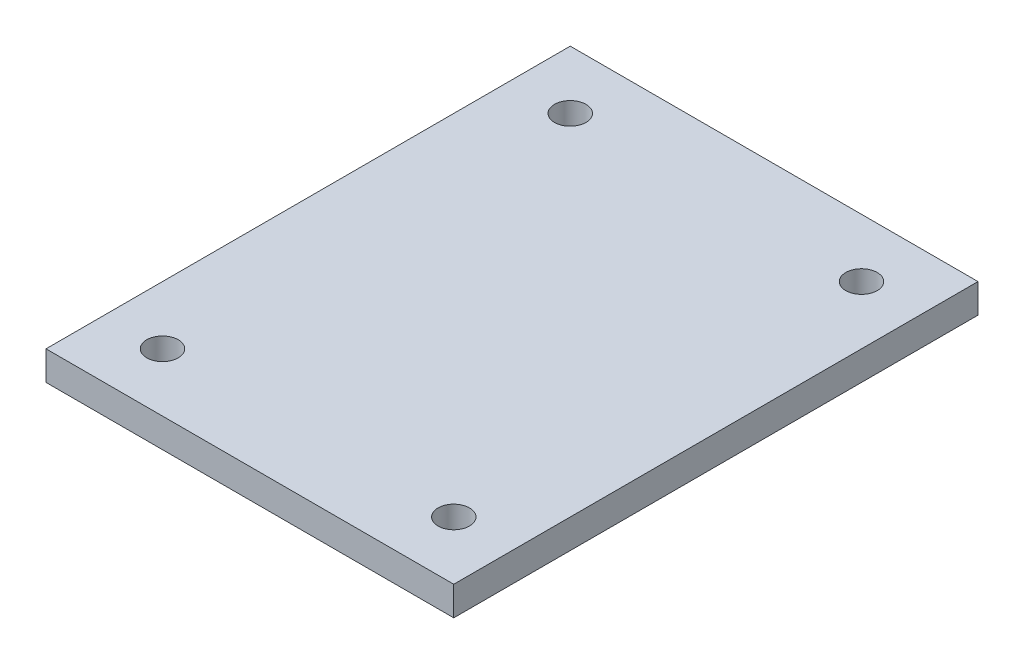
ISO-10303-21;
HEADER;
FILE_DESCRIPTION(('STEP AP214'),'2;1');
FILE_NAME('part.step','',(''),(''),'','','');
FILE_SCHEMA(('AUTOMOTIVE_DESIGN { 1 0 10303 214 1 1 1 1 }'));
ENDSEC;
DATA;
#1=APPLICATION_CONTEXT('core data for automotive mechanical design processes');
#2=APPLICATION_PROTOCOL_DEFINITION('international standard','automotive_design',2000,#1);
#3=PRODUCT_CONTEXT('',#1,'mechanical');
#4=PRODUCT('Part','Part','',(#3));
#5=PRODUCT_RELATED_PRODUCT_CATEGORY('part','',(#4));
#6=PRODUCT_DEFINITION_FORMATION('','',#4);
#7=PRODUCT_DEFINITION_CONTEXT('part definition',#1,'design');
#8=PRODUCT_DEFINITION('design','',#6,#7);
#9=PRODUCT_DEFINITION_SHAPE('','',#8);
#10=(LENGTH_UNIT() NAMED_UNIT(*) SI_UNIT(.MILLI.,.METRE.));
#11=(NAMED_UNIT(*) PLANE_ANGLE_UNIT() SI_UNIT($,.RADIAN.));
#12=(NAMED_UNIT(*) SI_UNIT($,.STERADIAN.) SOLID_ANGLE_UNIT());
#13=UNCERTAINTY_MEASURE_WITH_UNIT(LENGTH_MEASURE(1.E-05),#10,'distance_accuracy_value','');
#14=(GEOMETRIC_REPRESENTATION_CONTEXT(3) GLOBAL_UNCERTAINTY_ASSIGNED_CONTEXT((#13)) GLOBAL_UNIT_ASSIGNED_CONTEXT((#10,
#11,#12)) REPRESENTATION_CONTEXT('',''));
#15=CARTESIAN_POINT('',(0.,0.,0.));
#16=DIRECTION('',(0.,0.,1.));
#17=DIRECTION('',(1.,0.,0.));
#18=AXIS2_PLACEMENT_3D('',#15,#16,#17);
#19=CARTESIAN_POINT('',(44.45,6.35,-57.15));
#20=DIRECTION('',(-1.,0.,0.));
#21=DIRECTION('',(0.,0.,1.));
#22=AXIS2_PLACEMENT_3D('',#19,#20,#21);
#23=PLANE('',#22);
#24=DIRECTION('',(0.,0.,-1.));
#25=VECTOR('',#24,1.);
#26=CARTESIAN_POINT('',(44.45,0.,-57.15));
#27=LINE('',#26,#25);
#28=CARTESIAN_POINT('',(44.45,0.,57.15));
#29=VERTEX_POINT('',#28);
#30=CARTESIAN_POINT('',(44.45,0.,-57.15));
#31=VERTEX_POINT('',#30);
#32=EDGE_CURVE('E96',#29,#31,#27,.T.);
#33=ORIENTED_EDGE('',*,*,#32,.T.);
#34=DIRECTION('',(0.,-1.,0.));
#35=VECTOR('',#34,1.);
#36=CARTESIAN_POINT('',(44.45,6.35,-57.15));
#37=LINE('',#36,#35);
#38=CARTESIAN_POINT('',(44.45,6.35,-57.15));
#39=VERTEX_POINT('',#38);
#40=EDGE_CURVE('E11',#39,#31,#37,.T.);
#41=ORIENTED_EDGE('',*,*,#40,.F.);
#42=DIRECTION('',(0.,0.,-1.));
#43=VECTOR('',#42,1.);
#44=CARTESIAN_POINT('',(44.45,6.35,-57.15));
#45=LINE('',#44,#43);
#46=CARTESIAN_POINT('',(44.45,6.35,57.15));
#47=VERTEX_POINT('',#46);
#48=EDGE_CURVE('E84',#47,#39,#45,.T.);
#49=ORIENTED_EDGE('',*,*,#48,.F.);
#50=DIRECTION('',(0.,-1.,0.));
#51=VECTOR('',#50,1.);
#52=CARTESIAN_POINT('',(44.45,6.35,57.15));
#53=LINE('',#52,#51);
#54=EDGE_CURVE('E92',#47,#29,#53,.T.);
#55=ORIENTED_EDGE('',*,*,#54,.T.);
#56=EDGE_LOOP('',(#33,#41,#49,#55));
#57=FACE_BOUND('',#56,.T.);
#58=ADVANCED_FACE('F33',(#57),#23,.F.);
#59=CARTESIAN_POINT('',(-44.45,6.35,-57.15));
#60=DIRECTION('',(0.,0.,1.));
#61=DIRECTION('',(1.,0.,0.));
#62=AXIS2_PLACEMENT_3D('',#59,#60,#61);
#63=PLANE('',#62);
#64=DIRECTION('',(-1.,0.,0.));
#65=VECTOR('',#64,1.);
#66=CARTESIAN_POINT('',(-44.45,0.,-57.15));
#67=LINE('',#66,#65);
#68=CARTESIAN_POINT('',(-44.45,0.,-57.15));
#69=VERTEX_POINT('',#68);
#70=EDGE_CURVE('E88',#31,#69,#67,.T.);
#71=ORIENTED_EDGE('',*,*,#70,.T.);
#72=DIRECTION('',(0.,-1.,0.));
#73=VECTOR('',#72,1.);
#74=CARTESIAN_POINT('',(-44.45,6.35,-57.15));
#75=LINE('',#74,#73);
#76=CARTESIAN_POINT('',(-44.45,6.35,-57.15));
#77=VERTEX_POINT('',#76);
#78=EDGE_CURVE('E41',#77,#69,#75,.T.);
#79=ORIENTED_EDGE('',*,*,#78,.F.);
#80=DIRECTION('',(-1.,0.,0.));
#81=VECTOR('',#80,1.);
#82=CARTESIAN_POINT('',(-44.45,6.35,-57.15));
#83=LINE('',#82,#81);
#84=EDGE_CURVE('E79',#39,#77,#83,.T.);
#85=ORIENTED_EDGE('',*,*,#84,.F.);
#86=ORIENTED_EDGE('',*,*,#40,.T.);
#87=EDGE_LOOP('',(#71,#79,#85,#86));
#88=FACE_BOUND('',#87,.T.);
#89=ADVANCED_FACE('F87',(#88),#63,.F.);
#90=CARTESIAN_POINT('',(-44.45,6.35,-57.15));
#91=DIRECTION('',(1.,0.,0.));
#92=DIRECTION('',(0.,0.,-1.));
#93=AXIS2_PLACEMENT_3D('',#90,#91,#92);
#94=PLANE('',#93);
#95=DIRECTION('',(0.,0.,1.));
#96=VECTOR('',#95,1.);
#97=CARTESIAN_POINT('',(-44.45,0.,-57.15));
#98=LINE('',#97,#96);
#99=CARTESIAN_POINT('',(-44.45,0.,57.15));
#100=VERTEX_POINT('',#99);
#101=EDGE_CURVE('E66',#69,#100,#98,.T.);
#102=ORIENTED_EDGE('',*,*,#101,.T.);
#103=DIRECTION('',(0.,-1.,0.));
#104=VECTOR('',#103,1.);
#105=CARTESIAN_POINT('',(-44.45,6.35,57.15));
#106=LINE('',#105,#104);
#107=CARTESIAN_POINT('',(-44.45,6.35,57.15));
#108=VERTEX_POINT('',#107);
#109=EDGE_CURVE('E89',#108,#100,#106,.T.);
#110=ORIENTED_EDGE('',*,*,#109,.F.);
#111=DIRECTION('',(0.,0.,1.));
#112=VECTOR('',#111,1.);
#113=CARTESIAN_POINT('',(-44.45,6.35,-57.15));
#114=LINE('',#113,#112);
#115=EDGE_CURVE('E82',#77,#108,#114,.T.);
#116=ORIENTED_EDGE('',*,*,#115,.F.);
#117=ORIENTED_EDGE('',*,*,#78,.T.);
#118=EDGE_LOOP('',(#102,#110,#116,#117));
#119=FACE_BOUND('',#118,.T.);
#120=ADVANCED_FACE('F90',(#119),#94,.F.);
#121=CARTESIAN_POINT('',(-44.45,6.35,57.15));
#122=DIRECTION('',(0.,0.,-1.));
#123=DIRECTION('',(-1.,0.,0.));
#124=AXIS2_PLACEMENT_3D('',#121,#122,#123);
#125=PLANE('',#124);
#126=DIRECTION('',(1.,0.,0.));
#127=VECTOR('',#126,1.);
#128=CARTESIAN_POINT('',(-44.45,0.,57.15));
#129=LINE('',#128,#127);
#130=EDGE_CURVE('E72',#100,#29,#129,.T.);
#131=ORIENTED_EDGE('',*,*,#130,.T.);
#132=ORIENTED_EDGE('',*,*,#54,.F.);
#133=DIRECTION('',(1.,0.,0.));
#134=VECTOR('',#133,1.);
#135=CARTESIAN_POINT('',(-44.45,6.35,57.15));
#136=LINE('',#135,#134);
#137=EDGE_CURVE('E49',#108,#47,#136,.T.);
#138=ORIENTED_EDGE('',*,*,#137,.F.);
#139=ORIENTED_EDGE('',*,*,#109,.T.);
#140=EDGE_LOOP('',(#131,#132,#138,#139));
#141=FACE_BOUND('',#140,.T.);
#142=ADVANCED_FACE('F104',(#141),#125,.F.);
#143=CARTESIAN_POINT('',(0.,6.35,0.));
#144=DIRECTION('',(0.,1.,0.));
#145=DIRECTION('',(0.,0.,1.));
#146=AXIS2_PLACEMENT_3D('',#143,#144,#145);
#147=PLANE('',#146);
#148=CARTESIAN_POINT('',(31.75,6.35,-44.45));
#149=DIRECTION('',(0.,1.,0.));
#150=DIRECTION('',(0.,0.,1.));
#151=AXIS2_PLACEMENT_3D('',#148,#149,#150);
#152=CIRCLE('',#151,3.42899999999999);
#153=CARTESIAN_POINT('',(31.75,6.35,-41.021));
#154=VERTEX_POINT('',#153);
#155=EDGE_CURVE('E128',#154,#154,#152,.F.);
#156=ORIENTED_EDGE('',*,*,#155,.T.);
#157=EDGE_LOOP('',(#156));
#158=FACE_BOUND('',#157,.T.);
#159=CARTESIAN_POINT('',(31.75,6.35,44.45));
#160=DIRECTION('',(0.,1.,0.));
#161=DIRECTION('',(0.,0.,1.));
#162=AXIS2_PLACEMENT_3D('',#159,#160,#161);
#163=CIRCLE('',#162,3.42899999999999);
#164=CARTESIAN_POINT('',(31.75,6.35,47.879));
#165=VERTEX_POINT('',#164);
#166=EDGE_CURVE('E122',#165,#165,#163,.F.);
#167=ORIENTED_EDGE('',*,*,#166,.T.);
#168=EDGE_LOOP('',(#167));
#169=FACE_BOUND('',#168,.T.);
#170=CARTESIAN_POINT('',(-31.75,6.35,-44.45));
#171=DIRECTION('',(0.,1.,0.));
#172=DIRECTION('',(0.,0.,1.));
#173=AXIS2_PLACEMENT_3D('',#170,#171,#172);
#174=CIRCLE('',#173,3.429);
#175=CARTESIAN_POINT('',(-31.75,6.35,-41.021));
#176=VERTEX_POINT('',#175);
#177=EDGE_CURVE('E116',#176,#176,#174,.F.);
#178=ORIENTED_EDGE('',*,*,#177,.T.);
#179=EDGE_LOOP('',(#178));
#180=FACE_BOUND('',#179,.T.);
#181=CARTESIAN_POINT('',(-31.75,6.35,44.45));
#182=DIRECTION('',(0.,1.,0.));
#183=DIRECTION('',(0.,0.,1.));
#184=AXIS2_PLACEMENT_3D('',#181,#182,#183);
#185=CIRCLE('',#184,3.429);
#186=CARTESIAN_POINT('',(-31.75,6.35,47.879));
#187=VERTEX_POINT('',#186);
#188=EDGE_CURVE('E110',#187,#187,#185,.F.);
#189=ORIENTED_EDGE('',*,*,#188,.T.);
#190=EDGE_LOOP('',(#189));
#191=FACE_BOUND('',#190,.T.);
#192=ORIENTED_EDGE('',*,*,#48,.T.);
#193=ORIENTED_EDGE('',*,*,#84,.T.);
#194=ORIENTED_EDGE('',*,*,#115,.T.);
#195=ORIENTED_EDGE('',*,*,#137,.T.);
#196=EDGE_LOOP('',(#192,#193,#194,#195));
#197=FACE_BOUND('',#196,.T.);
#198=ADVANCED_FACE('F80',(#158,#169,#180,#191,#197),#147,.T.);
#199=CARTESIAN_POINT('',(0.,0.,0.));
#200=DIRECTION('',(0.,1.,0.));
#201=DIRECTION('',(0.,0.,1.));
#202=AXIS2_PLACEMENT_3D('',#199,#200,#201);
#203=PLANE('',#202);
#204=CARTESIAN_POINT('',(31.75,0.,-44.45));
#205=DIRECTION('',(0.,-1.,0.));
#206=DIRECTION('',(0.,0.,-1.));
#207=AXIS2_PLACEMENT_3D('',#204,#205,#206);
#208=CIRCLE('',#207,3.42899999999999);
#209=CARTESIAN_POINT('',(31.75,0.,-47.879));
#210=VERTEX_POINT('',#209);
#211=EDGE_CURVE('E125',#210,#210,#208,.T.);
#212=ORIENTED_EDGE('',*,*,#211,.F.);
#213=EDGE_LOOP('',(#212));
#214=FACE_BOUND('',#213,.T.);
#215=CARTESIAN_POINT('',(31.75,0.,44.45));
#216=DIRECTION('',(0.,-1.,0.));
#217=DIRECTION('',(0.,0.,1.));
#218=AXIS2_PLACEMENT_3D('',#215,#216,#217);
#219=CIRCLE('',#218,3.42899999999999);
#220=CARTESIAN_POINT('',(31.75,0.,47.879));
#221=VERTEX_POINT('',#220);
#222=EDGE_CURVE('E119',#221,#221,#219,.T.);
#223=ORIENTED_EDGE('',*,*,#222,.F.);
#224=EDGE_LOOP('',(#223));
#225=FACE_BOUND('',#224,.T.);
#226=CARTESIAN_POINT('',(-31.75,0.,-44.45));
#227=DIRECTION('',(0.,-1.,0.));
#228=DIRECTION('',(0.,0.,1.));
#229=AXIS2_PLACEMENT_3D('',#226,#227,#228);
#230=CIRCLE('',#229,3.429);
#231=CARTESIAN_POINT('',(-31.75,0.,-41.021));
#232=VERTEX_POINT('',#231);
#233=EDGE_CURVE('E113',#232,#232,#230,.T.);
#234=ORIENTED_EDGE('',*,*,#233,.F.);
#235=EDGE_LOOP('',(#234));
#236=FACE_BOUND('',#235,.T.);
#237=CARTESIAN_POINT('',(-31.75,0.,44.45));
#238=DIRECTION('',(0.,-1.,0.));
#239=DIRECTION('',(0.,0.,-1.));
#240=AXIS2_PLACEMENT_3D('',#237,#238,#239);
#241=CIRCLE('',#240,3.429);
#242=CARTESIAN_POINT('',(-31.75,0.,41.021));
#243=VERTEX_POINT('',#242);
#244=EDGE_CURVE('E99',#243,#243,#241,.T.);
#245=ORIENTED_EDGE('',*,*,#244,.F.);
#246=EDGE_LOOP('',(#245));
#247=FACE_BOUND('',#246,.T.);
#248=ORIENTED_EDGE('',*,*,#32,.F.);
#249=ORIENTED_EDGE('',*,*,#130,.F.);
#250=ORIENTED_EDGE('',*,*,#101,.F.);
#251=ORIENTED_EDGE('',*,*,#70,.F.);
#252=EDGE_LOOP('',(#248,#249,#250,#251));
#253=FACE_BOUND('',#252,.T.);
#254=ADVANCED_FACE('F107',(#214,#225,#236,#247,#253),#203,.F.);
#255=CARTESIAN_POINT('',(-31.75,6.351,44.45));
#256=DIRECTION('',(0.,-1.,0.));
#257=DIRECTION('',(0.,0.,-1.));
#258=AXIS2_PLACEMENT_3D('',#255,#256,#257);
#259=CYLINDRICAL_SURFACE('',#258,3.429);
#260=ORIENTED_EDGE('',*,*,#188,.F.);
#261=EDGE_LOOP('',(#260));
#262=FACE_BOUND('',#261,.T.);
#263=ORIENTED_EDGE('',*,*,#244,.T.);
#264=EDGE_LOOP('',(#263));
#265=FACE_BOUND('',#264,.T.);
#266=ADVANCED_FACE('F138',(#262,#265),#259,.F.);
#267=CARTESIAN_POINT('',(-31.75,6.351,-44.45));
#268=DIRECTION('',(0.,-1.,0.));
#269=DIRECTION('',(0.,0.,-1.));
#270=AXIS2_PLACEMENT_3D('',#267,#268,#269);
#271=CYLINDRICAL_SURFACE('',#270,3.429);
#272=ORIENTED_EDGE('',*,*,#177,.F.);
#273=EDGE_LOOP('',(#272));
#274=FACE_BOUND('',#273,.T.);
#275=ORIENTED_EDGE('',*,*,#233,.T.);
#276=EDGE_LOOP('',(#275));
#277=FACE_BOUND('',#276,.T.);
#278=ADVANCED_FACE('F147',(#274,#277),#271,.F.);
#279=CARTESIAN_POINT('',(31.75,6.351,44.45));
#280=DIRECTION('',(0.,-1.,0.));
#281=DIRECTION('',(0.,0.,-1.));
#282=AXIS2_PLACEMENT_3D('',#279,#280,#281);
#283=CYLINDRICAL_SURFACE('',#282,3.42899999999999);
#284=ORIENTED_EDGE('',*,*,#166,.F.);
#285=EDGE_LOOP('',(#284));
#286=FACE_BOUND('',#285,.T.);
#287=ORIENTED_EDGE('',*,*,#222,.T.);
#288=EDGE_LOOP('',(#287));
#289=FACE_BOUND('',#288,.T.);
#290=ADVANCED_FACE('F153',(#286,#289),#283,.F.);
#291=CARTESIAN_POINT('',(31.75,6.351,-44.45));
#292=DIRECTION('',(0.,-1.,0.));
#293=DIRECTION('',(0.,0.,-1.));
#294=AXIS2_PLACEMENT_3D('',#291,#292,#293);
#295=CYLINDRICAL_SURFACE('',#294,3.42899999999999);
#296=ORIENTED_EDGE('',*,*,#155,.F.);
#297=EDGE_LOOP('',(#296));
#298=FACE_BOUND('',#297,.T.);
#299=ORIENTED_EDGE('',*,*,#211,.T.);
#300=EDGE_LOOP('',(#299));
#301=FACE_BOUND('',#300,.T.);
#302=ADVANCED_FACE('F134',(#298,#301),#295,.F.);
#303=CLOSED_SHELL('',(#58,#89,#120,#142,#198,#254,#266,#278,#290,#302));
#304=MANIFOLD_SOLID_BREP('B2',#303);
#305=ADVANCED_BREP_SHAPE_REPRESENTATION('',(#18,#304),#14);
#306=SHAPE_DEFINITION_REPRESENTATION(#9,#305);
ENDSEC;
END-ISO-10303-21;
